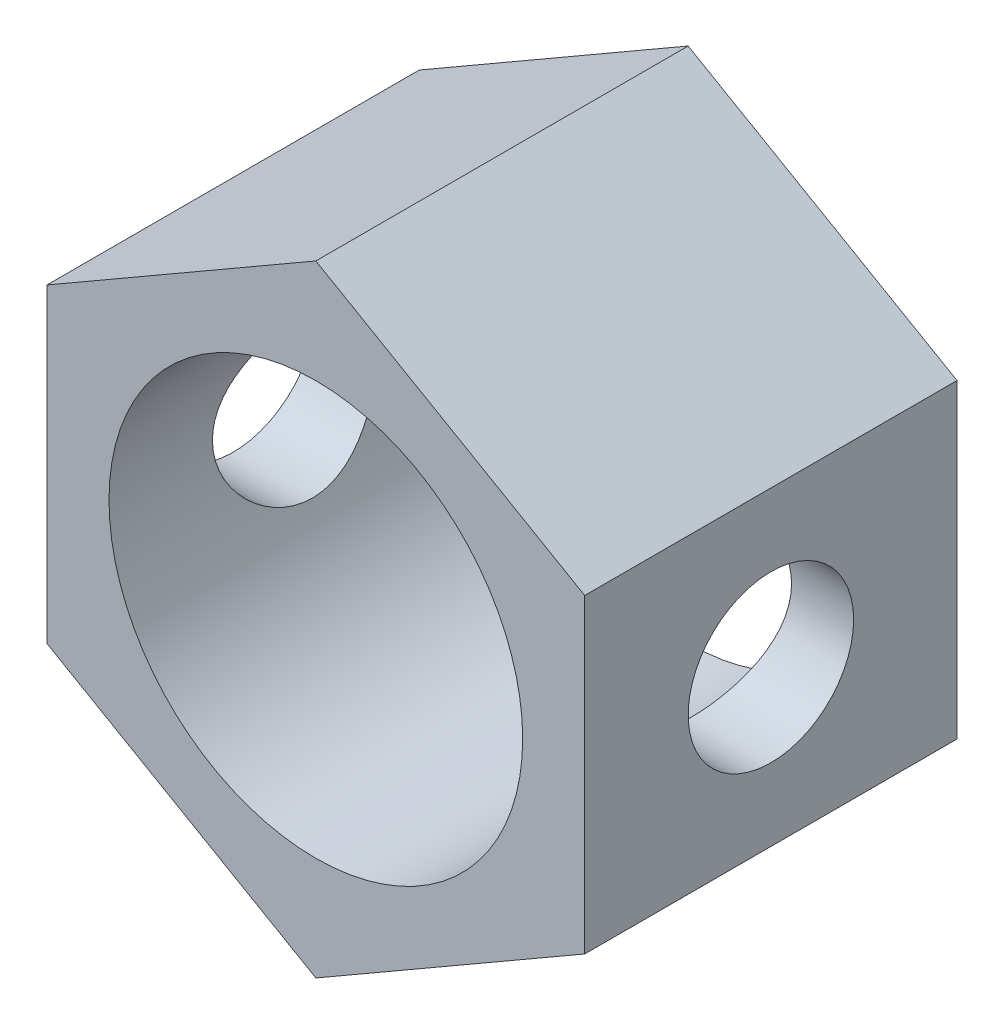
ISO-10303-21;
HEADER;
FILE_DESCRIPTION(('STEP AP214'),'2;1');
FILE_NAME('part.step','',(''),(''),'','','');
FILE_SCHEMA(('AUTOMOTIVE_DESIGN { 1 0 10303 214 1 1 1 1 }'));
ENDSEC;
DATA;
#1=APPLICATION_CONTEXT('core data for automotive mechanical design processes');
#2=APPLICATION_PROTOCOL_DEFINITION('international standard','automotive_design',2000,#1);
#3=PRODUCT_CONTEXT('',#1,'mechanical');
#4=PRODUCT('Part','Part','',(#3));
#5=PRODUCT_RELATED_PRODUCT_CATEGORY('part','',(#4));
#6=PRODUCT_DEFINITION_FORMATION('','',#4);
#7=PRODUCT_DEFINITION_CONTEXT('part definition',#1,'design');
#8=PRODUCT_DEFINITION('design','',#6,#7);
#9=PRODUCT_DEFINITION_SHAPE('','',#8);
#10=(LENGTH_UNIT() NAMED_UNIT(*) SI_UNIT(.MILLI.,.METRE.));
#11=(NAMED_UNIT(*) PLANE_ANGLE_UNIT() SI_UNIT($,.RADIAN.));
#12=(NAMED_UNIT(*) SI_UNIT($,.STERADIAN.) SOLID_ANGLE_UNIT());
#13=UNCERTAINTY_MEASURE_WITH_UNIT(LENGTH_MEASURE(1.E-05),#10,'distance_accuracy_value','');
#14=(GEOMETRIC_REPRESENTATION_CONTEXT(3) GLOBAL_UNCERTAINTY_ASSIGNED_CONTEXT((#13)) GLOBAL_UNIT_ASSIGNED_CONTEXT((#10,
#11,#12)) REPRESENTATION_CONTEXT('',''));
#15=CARTESIAN_POINT('',(0.,0.,0.));
#16=DIRECTION('',(0.,0.,1.));
#17=DIRECTION('',(1.,0.,0.));
#18=AXIS2_PLACEMENT_3D('',#15,#16,#17);
#19=CARTESIAN_POINT('',(0.,0.,9.));
#20=DIRECTION('',(0.,0.,1.));
#21=DIRECTION('',(1.,0.,0.));
#22=AXIS2_PLACEMENT_3D('',#19,#20,#21);
#23=PLANE('',#22);
#24=DIRECTION('',(-0.866025403784436,-0.500000000000004,0.));
#25=VECTOR('',#24,1.);
#26=CARTESIAN_POINT('',(-10.8618968386023,19.7898415907416,9.));
#27=LINE('',#26,#25);
#28=CARTESIAN_POINT('',(-10.8618968386023,19.7898415907416,9.));
#29=VERTEX_POINT('',#28);
#30=CARTESIAN_POINT('',(-17.3618968386023,16.037064841009,9.));
#31=VERTEX_POINT('',#30);
#32=EDGE_CURVE('E135',#29,#31,#27,.T.);
#33=ORIENTED_EDGE('',*,*,#32,.T.);
#34=DIRECTION('',(0.,-1.,0.));
#35=VECTOR('',#34,1.);
#36=CARTESIAN_POINT('',(-17.3618968386023,16.037064841009,9.));
#37=LINE('',#36,#35);
#38=CARTESIAN_POINT('',(-17.3618968386023,8.53151134154386,9.));
#39=VERTEX_POINT('',#38);
#40=EDGE_CURVE('E93',#31,#39,#37,.T.);
#41=ORIENTED_EDGE('',*,*,#40,.T.);
#42=DIRECTION('',(0.866025403784436,-0.500000000000004,0.));
#43=VECTOR('',#42,1.);
#44=CARTESIAN_POINT('',(-17.3618968386023,8.53151134154386,9.));
#45=LINE('',#44,#43);
#46=CARTESIAN_POINT('',(-10.8618968386023,4.77873459181125,9.));
#47=VERTEX_POINT('',#46);
#48=EDGE_CURVE('E106',#39,#47,#45,.T.);
#49=ORIENTED_EDGE('',*,*,#48,.T.);
#50=DIRECTION('',(0.866025403784436,0.500000000000004,0.));
#51=VECTOR('',#50,1.);
#52=CARTESIAN_POINT('',(-10.8618968386023,4.77873459181125,9.));
#53=LINE('',#52,#51);
#54=CARTESIAN_POINT('',(-4.36189683860228,8.53151134154386,9.));
#55=VERTEX_POINT('',#54);
#56=EDGE_CURVE('E100',#47,#55,#53,.T.);
#57=ORIENTED_EDGE('',*,*,#56,.T.);
#58=DIRECTION('',(0.,1.,0.));
#59=VECTOR('',#58,1.);
#60=CARTESIAN_POINT('',(-4.36189683860228,16.037064841009,9.));
#61=LINE('',#60,#59);
#62=CARTESIAN_POINT('',(-4.36189683860228,16.037064841009,9.));
#63=VERTEX_POINT('',#62);
#64=EDGE_CURVE('E104',#55,#63,#61,.T.);
#65=ORIENTED_EDGE('',*,*,#64,.T.);
#66=DIRECTION('',(-0.866025403784437,0.500000000000003,0.));
#67=VECTOR('',#66,1.);
#68=CARTESIAN_POINT('',(-4.36189683860228,16.037064841009,9.));
#69=LINE('',#68,#67);
#70=EDGE_CURVE('E56',#63,#29,#69,.T.);
#71=ORIENTED_EDGE('',*,*,#70,.T.);
#72=EDGE_LOOP('',(#33,#41,#49,#57,#65,#71));
#73=FACE_BOUND('',#72,.T.);
#74=CARTESIAN_POINT('',(-10.8618968386023,12.2842880912765,9.));
#75=DIRECTION('',(0.,0.,1.));
#76=DIRECTION('',(1.,0.,0.));
#77=AXIS2_PLACEMENT_3D('',#74,#75,#76);
#78=CIRCLE('',#77,5.);
#79=CARTESIAN_POINT('',(-5.86189683860228,12.2842880912765,9.));
#80=VERTEX_POINT('',#79);
#81=EDGE_CURVE('E128',#80,#80,#78,.T.);
#82=ORIENTED_EDGE('',*,*,#81,.F.);
#83=EDGE_LOOP('',(#82));
#84=FACE_BOUND('',#83,.T.);
#85=ADVANCED_FACE('F33',(#73,#84),#23,.T.);
#86=CARTESIAN_POINT('',(0.,0.,0.));
#87=DIRECTION('',(0.,0.,1.));
#88=DIRECTION('',(1.,0.,0.));
#89=AXIS2_PLACEMENT_3D('',#86,#87,#88);
#90=PLANE('',#89);
#91=DIRECTION('',(-0.866025403784436,-0.500000000000004,0.));
#92=VECTOR('',#91,1.);
#93=CARTESIAN_POINT('',(-10.8618968386023,19.7898415907416,0.));
#94=LINE('',#93,#92);
#95=CARTESIAN_POINT('',(-10.8618968386023,19.7898415907416,0.));
#96=VERTEX_POINT('',#95);
#97=CARTESIAN_POINT('',(-17.3618968386023,16.037064841009,0.));
#98=VERTEX_POINT('',#97);
#99=EDGE_CURVE('E124',#96,#98,#94,.T.);
#100=ORIENTED_EDGE('',*,*,#99,.F.);
#101=DIRECTION('',(-0.866025403784437,0.500000000000003,0.));
#102=VECTOR('',#101,1.);
#103=CARTESIAN_POINT('',(-4.36189683860228,16.037064841009,0.));
#104=LINE('',#103,#102);
#105=CARTESIAN_POINT('',(-4.36189683860228,16.037064841009,0.));
#106=VERTEX_POINT('',#105);
#107=EDGE_CURVE('E85',#106,#96,#104,.T.);
#108=ORIENTED_EDGE('',*,*,#107,.F.);
#109=DIRECTION('',(0.,1.,0.));
#110=VECTOR('',#109,1.);
#111=CARTESIAN_POINT('',(-4.36189683860228,16.037064841009,0.));
#112=LINE('',#111,#110);
#113=CARTESIAN_POINT('',(-4.36189683860228,8.53151134154386,0.));
#114=VERTEX_POINT('',#113);
#115=EDGE_CURVE('E79',#114,#106,#112,.T.);
#116=ORIENTED_EDGE('',*,*,#115,.F.);
#117=DIRECTION('',(0.866025403784436,0.500000000000004,0.));
#118=VECTOR('',#117,1.);
#119=CARTESIAN_POINT('',(-10.8618968386023,4.77873459181125,0.));
#120=LINE('',#119,#118);
#121=CARTESIAN_POINT('',(-10.8618968386023,4.77873459181125,0.));
#122=VERTEX_POINT('',#121);
#123=EDGE_CURVE('E114',#122,#114,#120,.T.);
#124=ORIENTED_EDGE('',*,*,#123,.F.);
#125=DIRECTION('',(0.866025403784436,-0.500000000000004,0.));
#126=VECTOR('',#125,1.);
#127=CARTESIAN_POINT('',(-17.3618968386023,8.53151134154386,0.));
#128=LINE('',#127,#126);
#129=CARTESIAN_POINT('',(-17.3618968386023,8.53151134154386,0.));
#130=VERTEX_POINT('',#129);
#131=EDGE_CURVE('E130',#130,#122,#128,.T.);
#132=ORIENTED_EDGE('',*,*,#131,.F.);
#133=DIRECTION('',(0.,-1.,0.));
#134=VECTOR('',#133,1.);
#135=CARTESIAN_POINT('',(-17.3618968386023,16.037064841009,0.));
#136=LINE('',#135,#134);
#137=EDGE_CURVE('E127',#98,#130,#136,.T.);
#138=ORIENTED_EDGE('',*,*,#137,.F.);
#139=EDGE_LOOP('',(#100,#108,#116,#124,#132,#138));
#140=FACE_BOUND('',#139,.T.);
#141=CARTESIAN_POINT('',(-10.8618968386023,12.2842880912765,0.));
#142=DIRECTION('',(0.,0.,1.));
#143=DIRECTION('',(1.,0.,0.));
#144=AXIS2_PLACEMENT_3D('',#141,#142,#143);
#145=CIRCLE('',#144,5.);
#146=CARTESIAN_POINT('',(-5.86189683860228,12.2842880912765,0.));
#147=VERTEX_POINT('',#146);
#148=EDGE_CURVE('E198',#147,#147,#145,.T.);
#149=ORIENTED_EDGE('',*,*,#148,.T.);
#150=EDGE_LOOP('',(#149));
#151=FACE_BOUND('',#150,.T.);
#152=ADVANCED_FACE('F163',(#140,#151),#90,.F.);
#153=CARTESIAN_POINT('',(-10.8618968386023,19.7898415907416,9.));
#154=DIRECTION('',(0.500000000000004,-0.866025403784436,0.));
#155=DIRECTION('',(0.866025403784437,0.500000000000004,0.));
#156=AXIS2_PLACEMENT_3D('',#153,#154,#155);
#157=PLANE('',#156);
#158=ORIENTED_EDGE('',*,*,#99,.T.);
#159=DIRECTION('',(0.,0.,-1.));
#160=VECTOR('',#159,1.);
#161=CARTESIAN_POINT('',(-17.3618968386023,16.037064841009,9.));
#162=LINE('',#161,#160);
#163=EDGE_CURVE('E11',#31,#98,#162,.T.);
#164=ORIENTED_EDGE('',*,*,#163,.F.);
#165=ORIENTED_EDGE('',*,*,#32,.F.);
#166=DIRECTION('',(0.,0.,-1.));
#167=VECTOR('',#166,1.);
#168=CARTESIAN_POINT('',(-10.8618968386023,19.7898415907416,9.));
#169=LINE('',#168,#167);
#170=EDGE_CURVE('E120',#29,#96,#169,.T.);
#171=ORIENTED_EDGE('',*,*,#170,.T.);
#172=EDGE_LOOP('',(#158,#164,#165,#171));
#173=FACE_BOUND('',#172,.T.);
#174=ADVANCED_FACE('F35',(#173),#157,.F.);
#175=CARTESIAN_POINT('',(-17.3618968386023,16.037064841009,9.));
#176=DIRECTION('',(1.,0.,0.));
#177=DIRECTION('',(0.,0.,-1.));
#178=AXIS2_PLACEMENT_3D('',#175,#176,#177);
#179=PLANE('',#178);
#180=CARTESIAN_POINT('',(-17.3618968386023,12.2842880912764,4.5));
#181=DIRECTION('',(1.,0.,0.));
#182=DIRECTION('',(0.,0.,-1.));
#183=AXIS2_PLACEMENT_3D('',#180,#181,#182);
#184=CIRCLE('',#183,2.);
#185=CARTESIAN_POINT('',(-17.3618968386023,12.2842880912764,2.5));
#186=VERTEX_POINT('',#185);
#187=EDGE_CURVE('E189',#186,#186,#184,.T.);
#188=ORIENTED_EDGE('',*,*,#187,.T.);
#189=EDGE_LOOP('',(#188));
#190=FACE_BOUND('',#189,.T.);
#191=ORIENTED_EDGE('',*,*,#137,.T.);
#192=DIRECTION('',(0.,0.,-1.));
#193=VECTOR('',#192,1.);
#194=CARTESIAN_POINT('',(-17.3618968386023,8.53151134154386,9.));
#195=LINE('',#194,#193);
#196=EDGE_CURVE('E47',#39,#130,#195,.T.);
#197=ORIENTED_EDGE('',*,*,#196,.F.);
#198=ORIENTED_EDGE('',*,*,#40,.F.);
#199=ORIENTED_EDGE('',*,*,#163,.T.);
#200=EDGE_LOOP('',(#191,#197,#198,#199));
#201=FACE_BOUND('',#200,.T.);
#202=ADVANCED_FACE('F179',(#190,#201),#179,.F.);
#203=CARTESIAN_POINT('',(-17.3618968386023,8.53151134154386,9.));
#204=DIRECTION('',(0.500000000000004,0.866025403784436,0.));
#205=DIRECTION('',(-0.866025403784436,0.500000000000004,0.));
#206=AXIS2_PLACEMENT_3D('',#203,#204,#205);
#207=PLANE('',#206);
#208=ORIENTED_EDGE('',*,*,#131,.T.);
#209=DIRECTION('',(0.,0.,-1.));
#210=VECTOR('',#209,1.);
#211=CARTESIAN_POINT('',(-10.8618968386023,4.77873459181125,9.));
#212=LINE('',#211,#210);
#213=EDGE_CURVE('E115',#47,#122,#212,.T.);
#214=ORIENTED_EDGE('',*,*,#213,.F.);
#215=ORIENTED_EDGE('',*,*,#48,.F.);
#216=ORIENTED_EDGE('',*,*,#196,.T.);
#217=EDGE_LOOP('',(#208,#214,#215,#216));
#218=FACE_BOUND('',#217,.T.);
#219=ADVANCED_FACE('F177',(#218),#207,.F.);
#220=CARTESIAN_POINT('',(-10.8618968386023,4.77873459181125,9.));
#221=DIRECTION('',(-0.500000000000004,0.866025403784436,0.));
#222=DIRECTION('',(-0.866025403784436,-0.500000000000004,0.));
#223=AXIS2_PLACEMENT_3D('',#220,#221,#222);
#224=PLANE('',#223);
#225=ORIENTED_EDGE('',*,*,#123,.T.);
#226=DIRECTION('',(0.,0.,-1.));
#227=VECTOR('',#226,1.);
#228=CARTESIAN_POINT('',(-4.36189683860228,8.53151134154386,9.));
#229=LINE('',#228,#227);
#230=EDGE_CURVE('E111',#55,#114,#229,.T.);
#231=ORIENTED_EDGE('',*,*,#230,.F.);
#232=ORIENTED_EDGE('',*,*,#56,.F.);
#233=ORIENTED_EDGE('',*,*,#213,.T.);
#234=EDGE_LOOP('',(#225,#231,#232,#233));
#235=FACE_BOUND('',#234,.T.);
#236=ADVANCED_FACE('F112',(#235),#224,.F.);
#237=CARTESIAN_POINT('',(-4.36189683860228,16.037064841009,9.));
#238=DIRECTION('',(-1.,0.,0.));
#239=DIRECTION('',(0.,0.,1.));
#240=AXIS2_PLACEMENT_3D('',#237,#238,#239);
#241=PLANE('',#240);
#242=CARTESIAN_POINT('',(-4.36189683860228,12.2842880912764,4.5));
#243=DIRECTION('',(1.,0.,0.));
#244=DIRECTION('',(0.,0.,-1.));
#245=AXIS2_PLACEMENT_3D('',#242,#243,#244);
#246=CIRCLE('',#245,2.);
#247=CARTESIAN_POINT('',(-4.36189683860228,12.2842880912764,2.5));
#248=VERTEX_POINT('',#247);
#249=EDGE_CURVE('E144',#248,#248,#246,.T.);
#250=ORIENTED_EDGE('',*,*,#249,.F.);
#251=EDGE_LOOP('',(#250));
#252=FACE_BOUND('',#251,.T.);
#253=ORIENTED_EDGE('',*,*,#115,.T.);
#254=DIRECTION('',(0.,0.,-1.));
#255=VECTOR('',#254,1.);
#256=CARTESIAN_POINT('',(-4.36189683860228,16.037064841009,9.));
#257=LINE('',#256,#255);
#258=EDGE_CURVE('E116',#63,#106,#257,.T.);
#259=ORIENTED_EDGE('',*,*,#258,.F.);
#260=ORIENTED_EDGE('',*,*,#64,.F.);
#261=ORIENTED_EDGE('',*,*,#230,.T.);
#262=EDGE_LOOP('',(#253,#259,#260,#261));
#263=FACE_BOUND('',#262,.T.);
#264=ADVANCED_FACE('F118',(#252,#263),#241,.F.);
#265=CARTESIAN_POINT('',(-4.36189683860228,16.037064841009,9.));
#266=DIRECTION('',(-0.500000000000003,-0.866025403784437,0.));
#267=DIRECTION('',(0.866025403784437,-0.500000000000003,0.));
#268=AXIS2_PLACEMENT_3D('',#265,#266,#267);
#269=PLANE('',#268);
#270=ORIENTED_EDGE('',*,*,#107,.T.);
#271=ORIENTED_EDGE('',*,*,#170,.F.);
#272=ORIENTED_EDGE('',*,*,#70,.F.);
#273=ORIENTED_EDGE('',*,*,#258,.T.);
#274=EDGE_LOOP('',(#270,#271,#272,#273));
#275=FACE_BOUND('',#274,.T.);
#276=ADVANCED_FACE('F159',(#275),#269,.F.);
#277=CARTESIAN_POINT('',(-10.8618968386023,12.2842880912765,9.));
#278=DIRECTION('',(0.,0.,-1.));
#279=DIRECTION('',(-1.,0.,0.));
#280=AXIS2_PLACEMENT_3D('',#277,#278,#279);
#281=CYLINDRICAL_SURFACE('',#280,5.);
#282=CARTESIAN_POINT('',(-15.8618968386023,12.2842880912765,6.5));
#283=CARTESIAN_POINT('',(-15.8618895508731,12.1767950858336,6.49999014817627));
#284=CARTESIAN_POINT('',(-15.8583897816716,12.0691155271858,6.49128224791163));
#285=CARTESIAN_POINT('',(-15.8447313696087,11.8567916108586,6.45675229647877));
#286=CARTESIAN_POINT('',(-15.8345546255911,11.7521563137152,6.43088372091387));
#287=CARTESIAN_POINT('',(-15.8086389307335,11.5493341685491,6.36312392194118));
#288=CARTESIAN_POINT('',(-15.792918202243,11.4511274296595,6.32128515378328));
#289=CARTESIAN_POINT('',(-15.7574629465631,11.2632161209481,6.22298082667346));
#290=CARTESIAN_POINT('',(-15.7377298131828,11.1735086145255,6.16652034508108));
#291=CARTESIAN_POINT('',(-15.6952057003065,11.0007870837061,6.03776450143908));
#292=CARTESIAN_POINT('',(-15.6723198078942,10.9182258187262,5.96489334375975));
#293=CARTESIAN_POINT('',(-15.6265026076642,10.7661130864917,5.80659999652324));
#294=CARTESIAN_POINT('',(-15.6035712831402,10.6965679841429,5.72117170278828));
#295=CARTESIAN_POINT('',(-15.5591247565736,10.5694135239836,5.53557192975775));
#296=CARTESIAN_POINT('',(-15.5377179982518,10.512473110081,5.43491351397682));
#297=CARTESIAN_POINT('',(-15.5002333104702,10.4165333722393,5.22446360157998));
#298=CARTESIAN_POINT('',(-15.484152851044,10.3775255269906,5.11467647215166));
#299=CARTESIAN_POINT('',(-15.4601604152105,10.3203892678806,4.89428766640792));
#300=CARTESIAN_POINT('',(-15.4519110421583,10.3013941254708,4.78394876442381));
#301=CARTESIAN_POINT('',(-15.4435368790937,10.2821151296364,4.56136500169275));
#302=CARTESIAN_POINT('',(-15.44340809383,10.2818220749632,4.44912110537501));
#303=CARTESIAN_POINT('',(-15.4510018414022,10.2992987237719,4.23424332854198));
#304=CARTESIAN_POINT('',(-15.4581785889868,10.3158127769713,4.13148428559099));
#305=CARTESIAN_POINT('',(-15.4786587146806,10.3643412109786,3.93034044399331));
#306=CARTESIAN_POINT('',(-15.491963161819,10.3963582964718,3.83195641188971));
#307=CARTESIAN_POINT('',(-15.5234916894876,10.4755933587254,3.63998216380398));
#308=CARTESIAN_POINT('',(-15.5418106314101,10.5231082289611,3.54653076094533));
#309=CARTESIAN_POINT('',(-15.5812780025012,10.6317816305442,3.36858418363846));
#310=CARTESIAN_POINT('',(-15.6024274931708,10.6929452861756,3.28409239059721));
#311=CARTESIAN_POINT('',(-15.647164206025,10.832737491822,3.11959027119802));
#312=CARTESIAN_POINT('',(-15.6708134883638,10.9123506283058,3.040431270554));
#313=CARTESIAN_POINT('',(-15.7164950881851,11.0839736638462,2.89631552199798));
#314=CARTESIAN_POINT('',(-15.7385270830555,11.175986025942,2.83136160258972));
#315=CARTESIAN_POINT('',(-15.7790436512478,11.3722104386706,2.71638255258418));
#316=CARTESIAN_POINT('',(-15.7974495395564,11.4766275999299,2.66667771880296));
#317=CARTESIAN_POINT('',(-15.8280451218899,11.6932643257935,2.58583213892195));
#318=CARTESIAN_POINT('',(-15.8402379732261,11.8054798944267,2.5546819624426));
#319=CARTESIAN_POINT('',(-15.8564582336714,12.0273922036686,2.5135517045803));
#320=CARTESIAN_POINT('',(-15.8609262969374,12.1368447972909,2.50242754574644));
#321=CARTESIAN_POINT('',(-15.8625816237086,12.3561334010842,2.49828689947139));
#322=CARTESIAN_POINT('',(-15.8597707744252,12.4659693045003,2.50526571845249));
#323=CARTESIAN_POINT('',(-15.8474725092398,12.6777208303984,2.53629175255199));
#324=CARTESIAN_POINT('',(-15.8382907520575,12.7797705830519,2.55955798035097));
#325=CARTESIAN_POINT('',(-15.8144912526573,12.9784235193372,2.62143570830981));
#326=CARTESIAN_POINT('',(-15.7998728121676,13.0750260015013,2.66004917966867));
#327=CARTESIAN_POINT('',(-15.7660627863104,13.2633668770931,2.75278493967994));
#328=CARTESIAN_POINT('',(-15.7467449984003,13.3548661140318,2.80734547204313));
#329=CARTESIAN_POINT('',(-15.7056304860575,13.527731682523,2.92994032390563));
#330=CARTESIAN_POINT('',(-15.683832769705,13.6090939320375,2.9979800429226));
#331=CARTESIAN_POINT('',(-15.6383480149834,13.7650111343052,3.15087001294961));
#332=CARTESIAN_POINT('',(-15.6146312528528,13.8387620250825,3.23653354150619));
#333=CARTESIAN_POINT('',(-15.5693135677736,13.9710392886901,3.41944008300935));
#334=CARTESIAN_POINT('',(-15.5477129938674,14.0295631526139,3.51668500033993));
#335=CARTESIAN_POINT('',(-15.5090398376794,14.1300955932081,3.72146169459408));
#336=CARTESIAN_POINT('',(-15.4920131474502,14.1719386858109,3.82908399921229));
#337=CARTESIAN_POINT('',(-15.4651335733816,14.2365843109817,4.05073365171513));
#338=CARTESIAN_POINT('',(-15.4552753955623,14.2594008965457,4.1647562058124));
#339=CARTESIAN_POINT('',(-15.4446144316016,14.2840037085548,4.38712790177452));
#340=CARTESIAN_POINT('',(-15.443211048684,14.2871851735793,4.49529483959333));
#341=CARTESIAN_POINT('',(-15.4480451989333,14.276091250554,4.71054485771327));
#342=CARTESIAN_POINT('',(-15.4542817618502,14.2618180791902,4.81762807390256));
#343=CARTESIAN_POINT('',(-15.4731633293925,14.2173594574301,5.02333218985502));
#344=CARTESIAN_POINT('',(-15.4855451568768,14.1878255848474,5.12212027443298));
#345=CARTESIAN_POINT('',(-15.5151368509293,14.1142935397675,5.31337862961346));
#346=CARTESIAN_POINT('',(-15.5323480506624,14.0702913726703,5.40584714689981));
#347=CARTESIAN_POINT('',(-15.5708829346472,13.9661608540362,5.58760961927076));
#348=CARTESIAN_POINT('',(-15.5923856617347,13.9052534264359,5.67641867013046));
#349=CARTESIAN_POINT('',(-15.6365348823247,13.770180210548,5.84299331720374));
#350=CARTESIAN_POINT('',(-15.6591817190863,13.6960104260946,5.9207555721283));
#351=CARTESIAN_POINT('',(-15.7048325094762,13.5307935975489,6.0682028532636));
#352=CARTESIAN_POINT('',(-15.7277644182241,13.4389640924226,6.13703730689805));
#353=CARTESIAN_POINT('',(-15.7699009057394,13.2441884115622,6.25833704262162));
#354=CARTESIAN_POINT('',(-15.7891037495313,13.1412370958237,6.31079471215252));
#355=CARTESIAN_POINT('',(-15.8212939867609,12.9290261537717,6.39662221519028));
#356=CARTESIAN_POINT('',(-15.8343904691526,12.8199197094962,6.43032932356033));
#357=CARTESIAN_POINT('',(-15.8533399006959,12.5971646375577,6.47863912095426));
#358=CARTESIAN_POINT('',(-15.8592158335587,12.4835316171354,6.4933024367439));
#359=CARTESIAN_POINT('',(-15.8616558336436,12.3412003891674,6.49939538097827));
#360=CARTESIAN_POINT('',(-15.861898768294,12.3127507800172,6.50000260862919));
#361=CARTESIAN_POINT('',(-15.8618968386023,12.2842880912765,6.5));
#362=B_SPLINE_CURVE_WITH_KNOTS('',3,(#282,#283,#284,#285,#286,#287,#288,#289,#290,#291,#292,
#293,#294,#295,#296,#297,#298,#299,#300,#301,#302,#303,#304,#305,#306,#307,#308,#309,#310,#311,
#312,#313,#314,#315,#316,#317,#318,#319,#320,#321,#322,#323,#324,#325,#326,#327,#328,#329,#330,
#331,#332,#333,#334,#335,#336,#337,#338,#339,#340,#341,#342,#343,#344,#345,#346,#347,#348,#349,
#350,#351,#352,#353,#354,#355,#356,#357,#358,#359,#360,#361),.UNSPECIFIED.,.T.,.F.,(4,2,2,2,2,2,
2,2,2,2,2,2,2,2,2,2,2,2,2,2,2,2,2,2,2,2,2,2,2,2,2,2,2,2,2,2,2,2,2,4),(0.,0.322402987893072,
0.645683636007935,0.967911457471583,1.29002753567984,1.62597381700397,1.96208394934411,
2.31315258819217,2.66405423118268,2.99904105308829,3.33386306340488,3.64538328401372,
3.95695787256048,4.27489126298816,4.59294421938183,4.93558349186557,5.27829092839732,
5.62776913162806,5.9770695611379,6.30569184528007,6.63422893570082,6.94800455564365,
7.26182048993796,7.58523513398262,7.90877959498969,8.25368474624413,8.59864669043748,
8.94695045140827,9.29499672645933,9.61799673392748,9.94095572563045,10.2511431854877,
10.5614163580516,10.8894546805669,11.2175920134839,11.5670042353384,11.9165786364053,
12.2596430101332,12.6016125240434,12.686980458968),.UNSPECIFIED.);
#363=CARTESIAN_POINT('',(-15.8618968386023,12.2842880912765,6.5));
#364=VERTEX_POINT('',#363);
#365=EDGE_CURVE('E37',#364,#364,#362,.T.);
#366=ORIENTED_EDGE('',*,*,#365,.F.);
#367=EDGE_LOOP('',(#366));
#368=FACE_BOUND('',#367,.T.);
#369=CARTESIAN_POINT('',(-5.86189683860228,12.2842880912764,2.5));
#370=CARTESIAN_POINT('',(-5.86190412633143,12.1767950858335,2.50000985182373));
#371=CARTESIAN_POINT('',(-5.86540389553296,12.0691155271858,2.50871775208838));
#372=CARTESIAN_POINT('',(-5.87906230759587,11.8567916108585,2.54324770352124));
#373=CARTESIAN_POINT('',(-5.88923905161351,11.7521563137152,2.56911627908613));
#374=CARTESIAN_POINT('',(-5.9151547464711,11.549334168549,2.63687607805883));
#375=CARTESIAN_POINT('',(-5.93087547496156,11.4511274296595,2.67871484621673));
#376=CARTESIAN_POINT('',(-5.96633073064151,11.2632161209481,2.77701917332655));
#377=CARTESIAN_POINT('',(-5.98606386402172,11.1735086145254,2.83347965491893));
#378=CARTESIAN_POINT('',(-6.0285879768981,11.000787083706,2.96223549856094));
#379=CARTESIAN_POINT('',(-6.05147386931038,10.9182258187262,3.03510665624027));
#380=CARTESIAN_POINT('',(-6.09729106954034,10.7661130864917,3.19340000347678));
#381=CARTESIAN_POINT('',(-6.12022239406437,10.6965679841429,3.27882829721174));
#382=CARTESIAN_POINT('',(-6.16466892063093,10.5694135239836,3.46442807024227));
#383=CARTESIAN_POINT('',(-6.18607567895278,10.512473110081,3.5650864860232));
#384=CARTESIAN_POINT('',(-6.22356036673436,10.4165333722393,3.77553639842004));
#385=CARTESIAN_POINT('',(-6.23964082616053,10.3775255269906,3.88532352784836));
#386=CARTESIAN_POINT('',(-6.26363326199411,10.3203892678806,4.1057123335921));
#387=CARTESIAN_POINT('',(-6.27188263504624,10.3013941254708,4.21605123557621));
#388=CARTESIAN_POINT('',(-6.28025679811085,10.2821151296364,4.43863499830727));
#389=CARTESIAN_POINT('',(-6.28038558337461,10.2818220749632,4.55087889462502));
#390=CARTESIAN_POINT('',(-6.27279183580235,10.2992987237719,4.76575667145805));
#391=CARTESIAN_POINT('',(-6.26561508821779,10.3158127769713,4.86851571440903));
#392=CARTESIAN_POINT('',(-6.24513496252393,10.3643412109786,5.06965955600671));
#393=CARTESIAN_POINT('',(-6.23183051538556,10.3963582964718,5.16804358811031));
#394=CARTESIAN_POINT('',(-6.20030198771699,10.4755933587254,5.36001783619604));
#395=CARTESIAN_POINT('',(-6.18198304579441,10.5231082289611,5.45346923905469));
#396=CARTESIAN_POINT('',(-6.14251567470339,10.6317816305442,5.63141581636156));
#397=CARTESIAN_POINT('',(-6.1213661840338,10.6929452861756,5.71590760940281));
#398=CARTESIAN_POINT('',(-6.07662947117958,10.832737491822,5.880409728802));
#399=CARTESIAN_POINT('',(-6.05298018884077,10.9123506283058,5.95956872944601));
#400=CARTESIAN_POINT('',(-6.00729858901947,11.0839736638462,6.10368447800204));
#401=CARTESIAN_POINT('',(-5.98526659414904,11.175986025942,6.16863839741029));
#402=CARTESIAN_POINT('',(-5.9447500259568,11.3722104386706,6.28361744741583));
#403=CARTESIAN_POINT('',(-5.92634413764814,11.47662759993,6.33332228119705));
#404=CARTESIAN_POINT('',(-5.89574855531469,11.6932643257936,6.41416786107806));
#405=CARTESIAN_POINT('',(-5.88355570397846,11.8054798944268,6.44531803755741));
#406=CARTESIAN_POINT('',(-5.86733544353318,12.0273922036686,6.4864482954197));
#407=CARTESIAN_POINT('',(-5.86286738026714,12.1368447972909,6.49757245425356));
#408=CARTESIAN_POINT('',(-5.86121205349597,12.3561334010843,6.50171310052861));
#409=CARTESIAN_POINT('',(-5.86402290277936,12.4659693045004,6.49473428154751));
#410=CARTESIAN_POINT('',(-5.87632116796475,12.6777208303984,6.46370824744801));
#411=CARTESIAN_POINT('',(-5.88550292514704,12.7797705830519,6.44044201964902));
#412=CARTESIAN_POINT('',(-5.90930242454728,12.9784235193372,6.37856429169019));
#413=CARTESIAN_POINT('',(-5.92392086503697,13.0750260015013,6.33995082033132));
#414=CARTESIAN_POINT('',(-5.95773089089416,13.2633668770931,6.24721506032005));
#415=CARTESIAN_POINT('',(-5.97704867880424,13.3548661140318,6.19265452795685));
#416=CARTESIAN_POINT('',(-6.01816319114703,13.527731682523,6.07005967609435));
#417=CARTESIAN_POINT('',(-6.03996090749957,13.6090939320376,6.00201995707738));
#418=CARTESIAN_POINT('',(-6.08544566222115,13.7650111343053,5.84912998705037));
#419=CARTESIAN_POINT('',(-6.10916242435175,13.8387620250825,5.76346645849379));
#420=CARTESIAN_POINT('',(-6.15448010943095,13.9710392886901,5.58055991699063));
#421=CARTESIAN_POINT('',(-6.17608068333716,14.0295631526139,5.48331499966005));
#422=CARTESIAN_POINT('',(-6.21475383952518,14.1300955932081,5.2785383054059));
#423=CARTESIAN_POINT('',(-6.23178052975439,14.1719386858109,5.17091600078769));
#424=CARTESIAN_POINT('',(-6.25866010382295,14.2365843109817,4.94926634828484));
#425=CARTESIAN_POINT('',(-6.26851828164229,14.2594008965458,4.83524379418757));
#426=CARTESIAN_POINT('',(-6.27917924560301,14.2840037085548,4.61287209822546));
#427=CARTESIAN_POINT('',(-6.28058262852056,14.2871851735793,4.50470516040665));
#428=CARTESIAN_POINT('',(-6.27574847827129,14.276091250554,4.28945514228671));
#429=CARTESIAN_POINT('',(-6.26951191535434,14.2618180791902,4.18237192609741));
#430=CARTESIAN_POINT('',(-6.25063034781206,14.2173594574301,3.97666781014496));
#431=CARTESIAN_POINT('',(-6.23824852032778,14.1878255848474,3.877879725567));
#432=CARTESIAN_POINT('',(-6.2086568262753,14.1142935397675,3.68662137038651));
#433=CARTESIAN_POINT('',(-6.1914456265422,14.0702913726702,3.59415285310017));
#434=CARTESIAN_POINT('',(-6.15291074255736,13.9661608540362,3.41239038072922));
#435=CARTESIAN_POINT('',(-6.13140801546985,13.9052534264359,3.32358132986951));
#436=CARTESIAN_POINT('',(-6.0872587948799,13.7701802105479,3.15700668279624));
#437=CARTESIAN_POINT('',(-6.06461195811821,13.6960104260946,3.07924442787168));
#438=CARTESIAN_POINT('',(-6.01896116772833,13.5307935975489,2.93179714673638));
#439=CARTESIAN_POINT('',(-5.99602925898042,13.4389640924226,2.86296269310193));
#440=CARTESIAN_POINT('',(-5.95389277146511,13.2441884115622,2.74166295737836));
#441=CARTESIAN_POINT('',(-5.93468992767321,13.1412370958237,2.68920528784747));
#442=CARTESIAN_POINT('',(-5.90249969044366,12.9290261537716,2.60337778480971));
#443=CARTESIAN_POINT('',(-5.889403208052,12.8199197094961,2.56967067643966));
#444=CARTESIAN_POINT('',(-5.87045377650862,12.5971646375577,2.52136087904573));
#445=CARTESIAN_POINT('',(-5.8645778436459,12.4835316171353,2.5066975632561));
#446=CARTESIAN_POINT('',(-5.86213784356092,12.3412003891674,2.50060461902173));
#447=CARTESIAN_POINT('',(-5.86189490891052,12.3127507800172,2.49999739137081));
#448=CARTESIAN_POINT('',(-5.86189683860228,12.2842880912764,2.5));
#449=B_SPLINE_CURVE_WITH_KNOTS('',3,(#369,#370,#371,#372,#373,#374,#375,#376,#377,#378,#379,
#380,#381,#382,#383,#384,#385,#386,#387,#388,#389,#390,#391,#392,#393,#394,#395,#396,#397,#398,
#399,#400,#401,#402,#403,#404,#405,#406,#407,#408,#409,#410,#411,#412,#413,#414,#415,#416,#417,
#418,#419,#420,#421,#422,#423,#424,#425,#426,#427,#428,#429,#430,#431,#432,#433,#434,#435,#436,
#437,#438,#439,#440,#441,#442,#443,#444,#445,#446,#447,#448),.UNSPECIFIED.,.T.,.F.,(4,2,2,2,2,2,
2,2,2,2,2,2,2,2,2,2,2,2,2,2,2,2,2,2,2,2,2,2,2,2,2,2,2,2,2,2,2,2,2,4),(0.,0.32240298789307,
0.645683636007934,0.967911457471582,1.29002753567984,1.62597381700397,1.96208394934412,
2.31315258819217,2.66405423118268,2.99904105308829,3.33386306340488,3.64538328401372,
3.95695787256047,4.27489126298816,4.59294421938183,4.93558349186557,5.27829092839733,
5.62776913162806,5.9770695611379,6.30569184528008,6.63422893570082,6.94800455564366,
7.26182048993797,7.58523513398263,7.90877959498969,8.25368474624414,8.59864669043748,
8.94695045140827,9.29499672645934,9.61799673392748,9.94095572563045,10.2511431854877,
10.5614163580516,10.8894546805669,11.2175920134839,11.5670042353384,11.9165786364053,
12.2596430101332,12.6016125240434,12.686980458968),.UNSPECIFIED.);
#450=CARTESIAN_POINT('',(-5.86189683860228,12.2842880912764,2.5));
#451=VERTEX_POINT('',#450);
#452=EDGE_CURVE('E140',#451,#451,#449,.T.);
#453=ORIENTED_EDGE('',*,*,#452,.F.);
#454=EDGE_LOOP('',(#453));
#455=FACE_BOUND('',#454,.T.);
#456=ORIENTED_EDGE('',*,*,#81,.T.);
#457=EDGE_LOOP('',(#456));
#458=FACE_BOUND('',#457,.T.);
#459=ORIENTED_EDGE('',*,*,#148,.F.);
#460=EDGE_LOOP('',(#459));
#461=FACE_BOUND('',#460,.T.);
#462=ADVANCED_FACE('F145',(#368,#455,#458,#461),#281,.F.);
#463=CARTESIAN_POINT('',(-24.3618968386023,12.2842880912764,4.5));
#464=DIRECTION('',(1.,0.,0.));
#465=DIRECTION('',(0.,0.,-1.));
#466=AXIS2_PLACEMENT_3D('',#463,#464,#465);
#467=CYLINDRICAL_SURFACE('',#466,2.);
#468=ORIENTED_EDGE('',*,*,#452,.T.);
#469=EDGE_LOOP('',(#468));
#470=FACE_BOUND('',#469,.T.);
#471=ORIENTED_EDGE('',*,*,#249,.T.);
#472=EDGE_LOOP('',(#471));
#473=FACE_BOUND('',#472,.T.);
#474=ADVANCED_FACE('F148',(#470,#473),#467,.F.);
#475=ORIENTED_EDGE('',*,*,#365,.T.);
#476=EDGE_LOOP('',(#475));
#477=FACE_BOUND('',#476,.T.);
#478=ORIENTED_EDGE('',*,*,#187,.F.);
#479=EDGE_LOOP('',(#478));
#480=FACE_BOUND('',#479,.T.);
#481=ADVANCED_FACE('F151',(#477,#480),#467,.F.);
#482=CLOSED_SHELL('',(#85,#152,#174,#202,#219,#236,#264,#276,#462,#474,#481));
#483=MANIFOLD_SOLID_BREP('B2',#482);
#484=ADVANCED_BREP_SHAPE_REPRESENTATION('',(#18,#483),#14);
#485=SHAPE_DEFINITION_REPRESENTATION(#9,#484);
ENDSEC;
END-ISO-10303-21;
